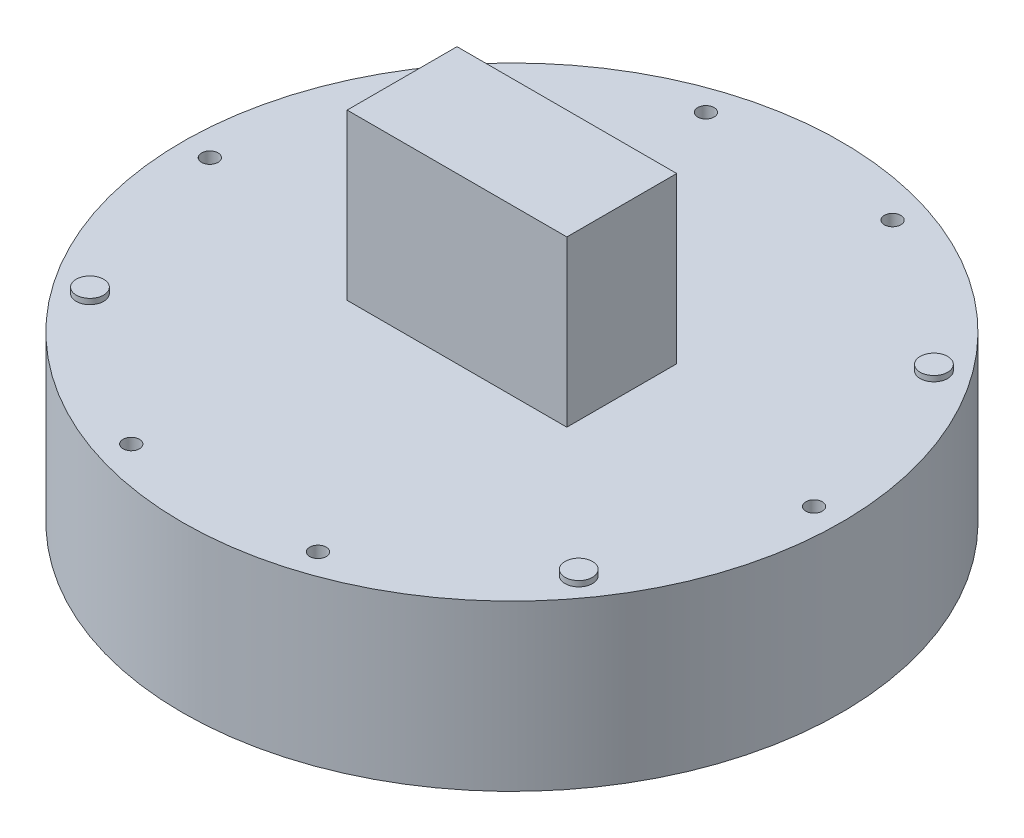
ISO-10303-21;
HEADER;
FILE_DESCRIPTION(('STEP AP214'),'2;1');
FILE_NAME('part.step','',(''),(''),'','','');
FILE_SCHEMA(('AUTOMOTIVE_DESIGN { 1 0 10303 214 1 1 1 1 }'));
ENDSEC;
DATA;
#1=APPLICATION_CONTEXT('core data for automotive mechanical design processes');
#2=APPLICATION_PROTOCOL_DEFINITION('international standard','automotive_design',2000,#1);
#3=PRODUCT_CONTEXT('',#1,'mechanical');
#4=PRODUCT('Part','Part','',(#3));
#5=PRODUCT_RELATED_PRODUCT_CATEGORY('part','',(#4));
#6=PRODUCT_DEFINITION_FORMATION('','',#4);
#7=PRODUCT_DEFINITION_CONTEXT('part definition',#1,'design');
#8=PRODUCT_DEFINITION('design','',#6,#7);
#9=PRODUCT_DEFINITION_SHAPE('','',#8);
#10=(LENGTH_UNIT() NAMED_UNIT(*) SI_UNIT(.MILLI.,.METRE.));
#11=(NAMED_UNIT(*) PLANE_ANGLE_UNIT() SI_UNIT($,.RADIAN.));
#12=(NAMED_UNIT(*) SI_UNIT($,.STERADIAN.) SOLID_ANGLE_UNIT());
#13=UNCERTAINTY_MEASURE_WITH_UNIT(LENGTH_MEASURE(1.E-05),#10,'distance_accuracy_value','');
#14=(GEOMETRIC_REPRESENTATION_CONTEXT(3) GLOBAL_UNCERTAINTY_ASSIGNED_CONTEXT((#13)) GLOBAL_UNIT_ASSIGNED_CONTEXT((#10,
#11,#12)) REPRESENTATION_CONTEXT('',''));
#15=CARTESIAN_POINT('',(0.,0.,0.));
#16=DIRECTION('',(0.,0.,1.));
#17=DIRECTION('',(1.,0.,0.));
#18=AXIS2_PLACEMENT_3D('',#15,#16,#17);
#19=CARTESIAN_POINT('',(0.,30.,0.));
#20=DIRECTION('',(0.,1.,0.));
#21=DIRECTION('',(0.,0.,1.));
#22=AXIS2_PLACEMENT_3D('',#19,#20,#21);
#23=PLANE('',#22);
#24=CARTESIAN_POINT('',(44.4959346906225,30.,32.3281888760854));
#25=DIRECTION('',(0.,1.,0.));
#26=DIRECTION('',(0.,0.,1.));
#27=AXIS2_PLACEMENT_3D('',#24,#25,#26);
#28=CIRCLE('',#27,2.5);
#29=CARTESIAN_POINT('',(44.4959346906225,30.,34.8281888760854));
#30=VERTEX_POINT('',#29);
#31=EDGE_CURVE('E603',#30,#30,#28,.T.);
#32=ORIENTED_EDGE('',*,*,#31,.F.);
#33=EDGE_LOOP('',(#32));
#34=FACE_BOUND('',#33,.T.);
#35=CARTESIAN_POINT('',(-44.4959346906218,30.,32.3281888760864));
#36=DIRECTION('',(0.,1.,0.));
#37=DIRECTION('',(0.,0.,1.));
#38=AXIS2_PLACEMENT_3D('',#35,#36,#37);
#39=CIRCLE('',#38,2.5);
#40=CARTESIAN_POINT('',(-44.4959346906218,30.,34.8281888760864));
#41=VERTEX_POINT('',#40);
#42=EDGE_CURVE('E594',#41,#41,#39,.T.);
#43=ORIENTED_EDGE('',*,*,#42,.F.);
#44=EDGE_LOOP('',(#43));
#45=FACE_BOUND('',#44,.T.);
#46=CARTESIAN_POINT('',(44.4959346906221,30.,-32.3281888760861));
#47=DIRECTION('',(0.,1.,0.));
#48=DIRECTION('',(0.,0.,1.));
#49=AXIS2_PLACEMENT_3D('',#46,#47,#48);
#50=CIRCLE('',#49,2.5);
#51=CARTESIAN_POINT('',(44.4959346906221,30.,-29.8281888760861));
#52=VERTEX_POINT('',#51);
#53=EDGE_CURVE('E585',#52,#52,#50,.T.);
#54=ORIENTED_EDGE('',*,*,#53,.F.);
#55=EDGE_LOOP('',(#54));
#56=FACE_BOUND('',#55,.T.);
#57=CARTESIAN_POINT('',(-44.4959346906223,30.,-32.3281888760858));
#58=DIRECTION('',(0.,1.,0.));
#59=DIRECTION('',(0.,0.,1.));
#60=AXIS2_PLACEMENT_3D('',#57,#58,#59);
#61=CIRCLE('',#60,2.5);
#62=CARTESIAN_POINT('',(-44.4959346906223,30.,-29.8281888760858));
#63=VERTEX_POINT('',#62);
#64=EDGE_CURVE('E576',#63,#63,#61,.T.);
#65=ORIENTED_EDGE('',*,*,#64,.F.);
#66=EDGE_LOOP('',(#65));
#67=FACE_BOUND('',#66,.T.);
#68=CARTESIAN_POINT('',(16.9959346906227,30.,52.3081083962333));
#69=DIRECTION('',(0.,1.,0.));
#70=DIRECTION('',(-0.95105651629515,0.,0.309016994374958));
#71=AXIS2_PLACEMENT_3D('',#68,#69,#70);
#72=CIRCLE('',#71,1.5);
#73=CARTESIAN_POINT('',(15.56934991618,30.,52.7716338877957));
#74=VERTEX_POINT('',#73);
#75=EDGE_CURVE('E150',#74,#74,#72,.T.);
#76=ORIENTED_EDGE('',*,*,#75,.F.);
#77=EDGE_LOOP('',(#76));
#78=FACE_BOUND('',#77,.T.);
#79=CARTESIAN_POINT('',(-16.9959346906216,30.,52.3081083962336));
#80=DIRECTION('',(0.,1.,0.));
#81=DIRECTION('',(-0.951056516295157,0.,-0.309016994374938));
#82=AXIS2_PLACEMENT_3D('',#79,#80,#81);
#83=CIRCLE('',#82,1.5);
#84=CARTESIAN_POINT('',(-18.4225194650643,30.,51.8445829046712));
#85=VERTEX_POINT('',#84);
#86=EDGE_CURVE('E144',#85,#85,#83,.T.);
#87=ORIENTED_EDGE('',*,*,#86,.F.);
#88=EDGE_LOOP('',(#87));
#89=FACE_BOUND('',#88,.T.);
#90=CARTESIAN_POINT('',(-55.,30.,0.));
#91=DIRECTION('',(0.,1.,0.));
#92=DIRECTION('',(0.,0.,-1.));
#93=AXIS2_PLACEMENT_3D('',#90,#91,#92);
#94=CIRCLE('',#93,1.5);
#95=CARTESIAN_POINT('',(-55.,30.,-1.5));
#96=VERTEX_POINT('',#95);
#97=EDGE_CURVE('E135',#96,#96,#94,.T.);
#98=ORIENTED_EDGE('',*,*,#97,.F.);
#99=EDGE_LOOP('',(#98));
#100=FACE_BOUND('',#99,.T.);
#101=CARTESIAN_POINT('',(-16.9959346906223,30.,-52.3081083962334));
#102=DIRECTION('',(0.,1.,0.));
#103=DIRECTION('',(0.951056516295152,0.,-0.309016994374952));
#104=AXIS2_PLACEMENT_3D('',#101,#102,#103);
#105=CIRCLE('',#104,1.5);
#106=CARTESIAN_POINT('',(-15.5693499161796,30.,-52.7716338877958));
#107=VERTEX_POINT('',#106);
#108=EDGE_CURVE('E126',#107,#107,#105,.T.);
#109=ORIENTED_EDGE('',*,*,#108,.F.);
#110=EDGE_LOOP('',(#109));
#111=FACE_BOUND('',#110,.T.);
#112=CARTESIAN_POINT('',(16.995934690622,30.,-52.3081083962335));
#113=DIRECTION('',(0.,1.,0.));
#114=DIRECTION('',(0.951056516295155,0.,0.309016994374945));
#115=AXIS2_PLACEMENT_3D('',#112,#113,#114);
#116=CIRCLE('',#115,1.5);
#117=CARTESIAN_POINT('',(18.4225194650647,30.,-51.8445829046711));
#118=VERTEX_POINT('',#117);
#119=EDGE_CURVE('E120',#118,#118,#116,.T.);
#120=ORIENTED_EDGE('',*,*,#119,.F.);
#121=EDGE_LOOP('',(#120));
#122=FACE_BOUND('',#121,.T.);
#123=CARTESIAN_POINT('',(55.,30.,0.));
#124=DIRECTION('',(0.,1.,0.));
#125=DIRECTION('',(0.,0.,1.));
#126=AXIS2_PLACEMENT_3D('',#123,#124,#125);
#127=CIRCLE('',#126,1.5);
#128=CARTESIAN_POINT('',(55.,30.,1.5));
#129=VERTEX_POINT('',#128);
#130=EDGE_CURVE('E157',#129,#129,#127,.T.);
#131=ORIENTED_EDGE('',*,*,#130,.F.);
#132=EDGE_LOOP('',(#131));
#133=FACE_BOUND('',#132,.T.);
#134=CARTESIAN_POINT('',(0.,30.,0.));
#135=DIRECTION('',(0.,1.,0.));
#136=DIRECTION('',(0.,0.,1.));
#137=AXIS2_PLACEMENT_3D('',#134,#135,#136);
#138=CIRCLE('',#137,60.);
#139=CARTESIAN_POINT('',(0.,30.,60.));
#140=VERTEX_POINT('',#139);
#141=EDGE_CURVE('E11',#140,#140,#138,.T.);
#142=ORIENTED_EDGE('',*,*,#141,.T.);
#143=EDGE_LOOP('',(#142));
#144=FACE_BOUND('',#143,.T.);
#145=DIRECTION('',(-1.,0.,0.));
#146=VECTOR('',#145,1.);
#147=CARTESIAN_POINT('',(-20.,30.,-10.));
#148=LINE('',#147,#146);
#149=CARTESIAN_POINT('',(20.,30.,-10.));
#150=VERTEX_POINT('',#149);
#151=CARTESIAN_POINT('',(-20.,30.,-10.));
#152=VERTEX_POINT('',#151);
#153=EDGE_CURVE('E93',#150,#152,#148,.T.);
#154=ORIENTED_EDGE('',*,*,#153,.F.);
#155=DIRECTION('',(0.,0.,-1.));
#156=VECTOR('',#155,1.);
#157=CARTESIAN_POINT('',(20.,30.,-10.));
#158=LINE('',#157,#156);
#159=CARTESIAN_POINT('',(20.,30.,10.));
#160=VERTEX_POINT('',#159);
#161=EDGE_CURVE('E104',#160,#150,#158,.T.);
#162=ORIENTED_EDGE('',*,*,#161,.F.);
#163=DIRECTION('',(1.,0.,0.));
#164=VECTOR('',#163,1.);
#165=CARTESIAN_POINT('',(-20.,30.,10.));
#166=LINE('',#165,#164);
#167=CARTESIAN_POINT('',(-20.,30.,10.));
#168=VERTEX_POINT('',#167);
#169=EDGE_CURVE('E74',#168,#160,#166,.T.);
#170=ORIENTED_EDGE('',*,*,#169,.F.);
#171=DIRECTION('',(0.,0.,1.));
#172=VECTOR('',#171,1.);
#173=CARTESIAN_POINT('',(-20.,30.,-10.));
#174=LINE('',#173,#172);
#175=EDGE_CURVE('E109',#152,#168,#174,.T.);
#176=ORIENTED_EDGE('',*,*,#175,.F.);
#177=EDGE_LOOP('',(#154,#162,#170,#176));
#178=FACE_BOUND('',#177,.T.);
#179=ADVANCED_FACE('F36',(#34,#45,#56,#67,#78,#89,#100,#111,#122,#133,#144,#178),#23,.T.);
#180=CARTESIAN_POINT('',(0.,30.,0.));
#181=DIRECTION('',(0.,-1.,0.));
#182=DIRECTION('',(0.,0.,-1.));
#183=AXIS2_PLACEMENT_3D('',#180,#181,#182);
#184=CYLINDRICAL_SURFACE('',#183,60.);
#185=ORIENTED_EDGE('',*,*,#141,.F.);
#186=EDGE_LOOP('',(#185));
#187=FACE_BOUND('',#186,.T.);
#188=CARTESIAN_POINT('',(0.,0.,0.));
#189=DIRECTION('',(0.,1.,0.));
#190=DIRECTION('',(0.,0.,1.));
#191=AXIS2_PLACEMENT_3D('',#188,#189,#190);
#192=CIRCLE('',#191,60.);
#193=CARTESIAN_POINT('',(0.,0.,60.));
#194=VERTEX_POINT('',#193);
#195=EDGE_CURVE('E40',#194,#194,#192,.T.);
#196=ORIENTED_EDGE('',*,*,#195,.T.);
#197=EDGE_LOOP('',(#196));
#198=FACE_BOUND('',#197,.T.);
#199=ADVANCED_FACE('F38',(#187,#198),#184,.T.);
#200=CARTESIAN_POINT('',(0.,0.,0.));
#201=DIRECTION('',(0.,1.,0.));
#202=DIRECTION('',(0.,0.,1.));
#203=AXIS2_PLACEMENT_3D('',#200,#201,#202);
#204=PLANE('',#203);
#205=ORIENTED_EDGE('',*,*,#195,.F.);
#206=EDGE_LOOP('',(#205));
#207=FACE_BOUND('',#206,.T.);
#208=ADVANCED_FACE('F279',(#207),#204,.F.);
#209=CARTESIAN_POINT('',(55.,25.,0.));
#210=DIRECTION('',(0.,1.,0.));
#211=DIRECTION('',(0.,0.,1.));
#212=AXIS2_PLACEMENT_3D('',#209,#210,#211);
#213=CYLINDRICAL_SURFACE('',#212,1.5);
#214=CARTESIAN_POINT('',(55.,25.,0.));
#215=DIRECTION('',(0.,1.,0.));
#216=DIRECTION('',(0.,0.,1.));
#217=AXIS2_PLACEMENT_3D('',#214,#215,#216);
#218=CIRCLE('',#217,1.5);
#219=CARTESIAN_POINT('',(55.,25.,1.5));
#220=VERTEX_POINT('',#219);
#221=EDGE_CURVE('E158',#220,#220,#218,.T.);
#222=ORIENTED_EDGE('',*,*,#221,.F.);
#223=EDGE_LOOP('',(#222));
#224=FACE_BOUND('',#223,.T.);
#225=ORIENTED_EDGE('',*,*,#130,.T.);
#226=EDGE_LOOP('',(#225));
#227=FACE_BOUND('',#226,.T.);
#228=ADVANCED_FACE('F164',(#224,#227),#213,.F.);
#229=CARTESIAN_POINT('',(55.,25.,0.));
#230=DIRECTION('',(0.,1.,0.));
#231=DIRECTION('',(0.,0.,1.));
#232=AXIS2_PLACEMENT_3D('',#229,#230,#231);
#233=PLANE('',#232);
#234=ORIENTED_EDGE('',*,*,#221,.T.);
#235=EDGE_LOOP('',(#234));
#236=FACE_BOUND('',#235,.T.);
#237=ADVANCED_FACE('F200',(#236),#233,.T.);
#238=CARTESIAN_POINT('',(16.995934690622,25.,-52.3081083962335));
#239=DIRECTION('',(0.,1.,0.));
#240=DIRECTION('',(0.,0.,1.));
#241=AXIS2_PLACEMENT_3D('',#238,#239,#240);
#242=CYLINDRICAL_SURFACE('',#241,1.5);
#243=CARTESIAN_POINT('',(16.995934690622,25.,-52.3081083962335));
#244=DIRECTION('',(0.,1.,0.));
#245=DIRECTION('',(0.951056516295155,0.,0.309016994374945));
#246=AXIS2_PLACEMENT_3D('',#243,#244,#245);
#247=CIRCLE('',#246,1.5);
#248=CARTESIAN_POINT('',(18.4225194650647,25.,-51.8445829046711));
#249=VERTEX_POINT('',#248);
#250=EDGE_CURVE('E116',#249,#249,#247,.T.);
#251=ORIENTED_EDGE('',*,*,#250,.F.);
#252=EDGE_LOOP('',(#251));
#253=FACE_BOUND('',#252,.T.);
#254=ORIENTED_EDGE('',*,*,#119,.T.);
#255=EDGE_LOOP('',(#254));
#256=FACE_BOUND('',#255,.T.);
#257=ADVANCED_FACE('F196',(#253,#256),#242,.F.);
#258=CARTESIAN_POINT('',(16.995934690622,25.,-52.3081083962335));
#259=DIRECTION('',(0.,1.,0.));
#260=DIRECTION('',(0.951056516295155,0.,0.309016994374945));
#261=AXIS2_PLACEMENT_3D('',#258,#259,#260);
#262=PLANE('',#261);
#263=ORIENTED_EDGE('',*,*,#250,.T.);
#264=EDGE_LOOP('',(#263));
#265=FACE_BOUND('',#264,.T.);
#266=ADVANCED_FACE('F192',(#265),#262,.T.);
#267=CARTESIAN_POINT('',(-16.9959346906223,25.,-52.3081083962334));
#268=DIRECTION('',(0.,1.,0.));
#269=DIRECTION('',(0.,0.,1.));
#270=AXIS2_PLACEMENT_3D('',#267,#268,#269);
#271=CYLINDRICAL_SURFACE('',#270,1.5);
#272=CARTESIAN_POINT('',(-16.9959346906223,25.,-52.3081083962334));
#273=DIRECTION('',(0.,1.,0.));
#274=DIRECTION('',(0.951056516295152,0.,-0.309016994374952));
#275=AXIS2_PLACEMENT_3D('',#272,#273,#274);
#276=CIRCLE('',#275,1.5);
#277=CARTESIAN_POINT('',(-15.5693499161796,25.,-52.7716338877958));
#278=VERTEX_POINT('',#277);
#279=EDGE_CURVE('E123',#278,#278,#276,.T.);
#280=ORIENTED_EDGE('',*,*,#279,.F.);
#281=EDGE_LOOP('',(#280));
#282=FACE_BOUND('',#281,.T.);
#283=ORIENTED_EDGE('',*,*,#108,.T.);
#284=EDGE_LOOP('',(#283));
#285=FACE_BOUND('',#284,.T.);
#286=ADVANCED_FACE('F195',(#282,#285),#271,.F.);
#287=CARTESIAN_POINT('',(-16.9959346906223,25.,-52.3081083962334));
#288=DIRECTION('',(0.,1.,0.));
#289=DIRECTION('',(0.951056516295152,0.,-0.309016994374952));
#290=AXIS2_PLACEMENT_3D('',#287,#288,#289);
#291=PLANE('',#290);
#292=ORIENTED_EDGE('',*,*,#279,.T.);
#293=EDGE_LOOP('',(#292));
#294=FACE_BOUND('',#293,.T.);
#295=ADVANCED_FACE('F202',(#294),#291,.T.);
#296=CARTESIAN_POINT('',(-55.,25.,0.));
#297=DIRECTION('',(0.,1.,0.));
#298=DIRECTION('',(0.,0.,1.));
#299=AXIS2_PLACEMENT_3D('',#296,#297,#298);
#300=CYLINDRICAL_SURFACE('',#299,1.5);
#301=CARTESIAN_POINT('',(-55.,25.,0.));
#302=DIRECTION('',(0.,1.,0.));
#303=DIRECTION('',(0.,0.,-1.));
#304=AXIS2_PLACEMENT_3D('',#301,#302,#303);
#305=CIRCLE('',#304,1.5);
#306=CARTESIAN_POINT('',(-55.,25.,-1.5));
#307=VERTEX_POINT('',#306);
#308=EDGE_CURVE('E132',#307,#307,#305,.T.);
#309=ORIENTED_EDGE('',*,*,#308,.F.);
#310=EDGE_LOOP('',(#309));
#311=FACE_BOUND('',#310,.T.);
#312=ORIENTED_EDGE('',*,*,#97,.T.);
#313=EDGE_LOOP('',(#312));
#314=FACE_BOUND('',#313,.T.);
#315=ADVANCED_FACE('F205',(#311,#314),#300,.F.);
#316=CARTESIAN_POINT('',(-55.,25.,0.));
#317=DIRECTION('',(0.,1.,0.));
#318=DIRECTION('',(0.,0.,-1.));
#319=AXIS2_PLACEMENT_3D('',#316,#317,#318);
#320=PLANE('',#319);
#321=ORIENTED_EDGE('',*,*,#308,.T.);
#322=EDGE_LOOP('',(#321));
#323=FACE_BOUND('',#322,.T.);
#324=ADVANCED_FACE('F221',(#323),#320,.T.);
#325=CARTESIAN_POINT('',(-16.9959346906216,25.,52.3081083962336));
#326=DIRECTION('',(0.,1.,0.));
#327=DIRECTION('',(0.,0.,1.));
#328=AXIS2_PLACEMENT_3D('',#325,#326,#327);
#329=CYLINDRICAL_SURFACE('',#328,1.5);
#330=CARTESIAN_POINT('',(-16.9959346906216,25.,52.3081083962336));
#331=DIRECTION('',(0.,1.,0.));
#332=DIRECTION('',(-0.951056516295157,0.,-0.309016994374938));
#333=AXIS2_PLACEMENT_3D('',#330,#331,#332);
#334=CIRCLE('',#333,1.5);
#335=CARTESIAN_POINT('',(-18.4225194650643,25.,51.8445829046712));
#336=VERTEX_POINT('',#335);
#337=EDGE_CURVE('E141',#336,#336,#334,.T.);
#338=ORIENTED_EDGE('',*,*,#337,.F.);
#339=EDGE_LOOP('',(#338));
#340=FACE_BOUND('',#339,.T.);
#341=ORIENTED_EDGE('',*,*,#86,.T.);
#342=EDGE_LOOP('',(#341));
#343=FACE_BOUND('',#342,.T.);
#344=ADVANCED_FACE('F224',(#340,#343),#329,.F.);
#345=CARTESIAN_POINT('',(-16.9959346906216,25.,52.3081083962336));
#346=DIRECTION('',(0.,1.,0.));
#347=DIRECTION('',(-0.951056516295157,0.,-0.309016994374938));
#348=AXIS2_PLACEMENT_3D('',#345,#346,#347);
#349=PLANE('',#348);
#350=ORIENTED_EDGE('',*,*,#337,.T.);
#351=EDGE_LOOP('',(#350));
#352=FACE_BOUND('',#351,.T.);
#353=ADVANCED_FACE('F240',(#352),#349,.T.);
#354=CARTESIAN_POINT('',(16.9959346906227,25.,52.3081083962333));
#355=DIRECTION('',(0.,1.,0.));
#356=DIRECTION('',(0.,0.,1.));
#357=AXIS2_PLACEMENT_3D('',#354,#355,#356);
#358=CYLINDRICAL_SURFACE('',#357,1.5);
#359=CARTESIAN_POINT('',(16.9959346906227,25.,52.3081083962333));
#360=DIRECTION('',(0.,1.,0.));
#361=DIRECTION('',(-0.95105651629515,0.,0.309016994374958));
#362=AXIS2_PLACEMENT_3D('',#359,#360,#361);
#363=CIRCLE('',#362,1.5);
#364=CARTESIAN_POINT('',(15.56934991618,25.,52.7716338877957));
#365=VERTEX_POINT('',#364);
#366=EDGE_CURVE('E147',#365,#365,#363,.T.);
#367=ORIENTED_EDGE('',*,*,#366,.F.);
#368=EDGE_LOOP('',(#367));
#369=FACE_BOUND('',#368,.T.);
#370=ORIENTED_EDGE('',*,*,#75,.T.);
#371=EDGE_LOOP('',(#370));
#372=FACE_BOUND('',#371,.T.);
#373=ADVANCED_FACE('F243',(#369,#372),#358,.F.);
#374=CARTESIAN_POINT('',(16.9959346906227,25.,52.3081083962333));
#375=DIRECTION('',(0.,1.,0.));
#376=DIRECTION('',(-0.95105651629515,0.,0.309016994374958));
#377=AXIS2_PLACEMENT_3D('',#374,#375,#376);
#378=PLANE('',#377);
#379=ORIENTED_EDGE('',*,*,#366,.T.);
#380=EDGE_LOOP('',(#379));
#381=FACE_BOUND('',#380,.T.);
#382=ADVANCED_FACE('F191',(#381),#378,.T.);
#383=CARTESIAN_POINT('',(20.,60.,-10.));
#384=DIRECTION('',(-1.,0.,0.));
#385=DIRECTION('',(0.,0.,1.));
#386=AXIS2_PLACEMENT_3D('',#383,#384,#385);
#387=PLANE('',#386);
#388=ORIENTED_EDGE('',*,*,#161,.T.);
#389=DIRECTION('',(0.,-1.,0.));
#390=VECTOR('',#389,1.);
#391=CARTESIAN_POINT('',(20.,60.,-10.));
#392=LINE('',#391,#390);
#393=CARTESIAN_POINT('',(20.,60.,-10.));
#394=VERTEX_POINT('',#393);
#395=EDGE_CURVE('E96',#394,#150,#392,.T.);
#396=ORIENTED_EDGE('',*,*,#395,.F.);
#397=DIRECTION('',(0.,0.,-1.));
#398=VECTOR('',#397,1.);
#399=CARTESIAN_POINT('',(20.,60.,-10.));
#400=LINE('',#399,#398);
#401=CARTESIAN_POINT('',(20.,60.,10.));
#402=VERTEX_POINT('',#401);
#403=EDGE_CURVE('E86',#402,#394,#400,.T.);
#404=ORIENTED_EDGE('',*,*,#403,.F.);
#405=DIRECTION('',(0.,-1.,0.));
#406=VECTOR('',#405,1.);
#407=CARTESIAN_POINT('',(20.,60.,10.));
#408=LINE('',#407,#406);
#409=EDGE_CURVE('E100',#402,#160,#408,.T.);
#410=ORIENTED_EDGE('',*,*,#409,.T.);
#411=EDGE_LOOP('',(#388,#396,#404,#410));
#412=FACE_BOUND('',#411,.T.);
#413=ADVANCED_FACE('F174',(#412),#387,.F.);
#414=CARTESIAN_POINT('',(-20.,60.,-10.));
#415=DIRECTION('',(0.,0.,1.));
#416=DIRECTION('',(1.,0.,0.));
#417=AXIS2_PLACEMENT_3D('',#414,#415,#416);
#418=PLANE('',#417);
#419=ORIENTED_EDGE('',*,*,#153,.T.);
#420=DIRECTION('',(0.,-1.,0.));
#421=VECTOR('',#420,1.);
#422=CARTESIAN_POINT('',(-20.,60.,-10.));
#423=LINE('',#422,#421);
#424=CARTESIAN_POINT('',(-20.,60.,-10.));
#425=VERTEX_POINT('',#424);
#426=EDGE_CURVE('E90',#425,#152,#423,.T.);
#427=ORIENTED_EDGE('',*,*,#426,.F.);
#428=DIRECTION('',(-1.,0.,0.));
#429=VECTOR('',#428,1.);
#430=CARTESIAN_POINT('',(-20.,60.,-10.));
#431=LINE('',#430,#429);
#432=EDGE_CURVE('E81',#394,#425,#431,.T.);
#433=ORIENTED_EDGE('',*,*,#432,.F.);
#434=ORIENTED_EDGE('',*,*,#395,.T.);
#435=EDGE_LOOP('',(#419,#427,#433,#434));
#436=FACE_BOUND('',#435,.T.);
#437=ADVANCED_FACE('F91',(#436),#418,.F.);
#438=CARTESIAN_POINT('',(-20.,60.,-10.));
#439=DIRECTION('',(1.,0.,0.));
#440=DIRECTION('',(0.,0.,-1.));
#441=AXIS2_PLACEMENT_3D('',#438,#439,#440);
#442=PLANE('',#441);
#443=ORIENTED_EDGE('',*,*,#175,.T.);
#444=DIRECTION('',(0.,-1.,0.));
#445=VECTOR('',#444,1.);
#446=CARTESIAN_POINT('',(-20.,60.,10.));
#447=LINE('',#446,#445);
#448=CARTESIAN_POINT('',(-20.,60.,10.));
#449=VERTEX_POINT('',#448);
#450=EDGE_CURVE('E52',#449,#168,#447,.T.);
#451=ORIENTED_EDGE('',*,*,#450,.F.);
#452=DIRECTION('',(0.,0.,1.));
#453=VECTOR('',#452,1.);
#454=CARTESIAN_POINT('',(-20.,60.,-10.));
#455=LINE('',#454,#453);
#456=EDGE_CURVE('E84',#425,#449,#455,.T.);
#457=ORIENTED_EDGE('',*,*,#456,.F.);
#458=ORIENTED_EDGE('',*,*,#426,.T.);
#459=EDGE_LOOP('',(#443,#451,#457,#458));
#460=FACE_BOUND('',#459,.T.);
#461=ADVANCED_FACE('F98',(#460),#442,.F.);
#462=CARTESIAN_POINT('',(-20.,60.,10.));
#463=DIRECTION('',(0.,0.,-1.));
#464=DIRECTION('',(-1.,0.,0.));
#465=AXIS2_PLACEMENT_3D('',#462,#463,#464);
#466=PLANE('',#465);
#467=ORIENTED_EDGE('',*,*,#169,.T.);
#468=ORIENTED_EDGE('',*,*,#409,.F.);
#469=DIRECTION('',(1.,0.,0.));
#470=VECTOR('',#469,1.);
#471=CARTESIAN_POINT('',(-20.,60.,10.));
#472=LINE('',#471,#470);
#473=EDGE_CURVE('E60',#449,#402,#472,.T.);
#474=ORIENTED_EDGE('',*,*,#473,.F.);
#475=ORIENTED_EDGE('',*,*,#450,.T.);
#476=EDGE_LOOP('',(#467,#468,#474,#475));
#477=FACE_BOUND('',#476,.T.);
#478=ADVANCED_FACE('F175',(#477),#466,.F.);
#479=CARTESIAN_POINT('',(0.,60.,0.));
#480=DIRECTION('',(0.,1.,0.));
#481=DIRECTION('',(0.,0.,1.));
#482=AXIS2_PLACEMENT_3D('',#479,#480,#481);
#483=PLANE('',#482);
#484=ORIENTED_EDGE('',*,*,#403,.T.);
#485=ORIENTED_EDGE('',*,*,#432,.T.);
#486=ORIENTED_EDGE('',*,*,#456,.T.);
#487=ORIENTED_EDGE('',*,*,#473,.T.);
#488=EDGE_LOOP('',(#484,#485,#486,#487));
#489=FACE_BOUND('',#488,.T.);
#490=ADVANCED_FACE('F82',(#489),#483,.T.);
#491=CARTESIAN_POINT('',(-44.4959346906223,31.,-32.3281888760858));
#492=DIRECTION('',(0.,-1.,0.));
#493=DIRECTION('',(0.,0.,-1.));
#494=AXIS2_PLACEMENT_3D('',#491,#492,#493);
#495=CYLINDRICAL_SURFACE('',#494,2.5);
#496=CARTESIAN_POINT('',(-44.4959346906223,31.,-32.3281888760858));
#497=DIRECTION('',(0.,1.,0.));
#498=DIRECTION('',(0.,0.,1.));
#499=AXIS2_PLACEMENT_3D('',#496,#497,#498);
#500=CIRCLE('',#499,2.5);
#501=CARTESIAN_POINT('',(-44.4959346906223,31.,-29.8281888760858));
#502=VERTEX_POINT('',#501);
#503=EDGE_CURVE('E573',#502,#502,#500,.T.);
#504=ORIENTED_EDGE('',*,*,#503,.F.);
#505=EDGE_LOOP('',(#504));
#506=FACE_BOUND('',#505,.T.);
#507=ORIENTED_EDGE('',*,*,#64,.T.);
#508=EDGE_LOOP('',(#507));
#509=FACE_BOUND('',#508,.T.);
#510=ADVANCED_FACE('F182',(#506,#509),#495,.T.);
#511=CARTESIAN_POINT('',(-44.4959346906223,31.,-32.3281888760858));
#512=DIRECTION('',(0.,1.,0.));
#513=DIRECTION('',(0.,0.,1.));
#514=AXIS2_PLACEMENT_3D('',#511,#512,#513);
#515=PLANE('',#514);
#516=ORIENTED_EDGE('',*,*,#503,.T.);
#517=EDGE_LOOP('',(#516));
#518=FACE_BOUND('',#517,.T.);
#519=ADVANCED_FACE('F458',(#518),#515,.T.);
#520=CARTESIAN_POINT('',(44.4959346906221,31.,-32.3281888760861));
#521=DIRECTION('',(0.,-1.,0.));
#522=DIRECTION('',(0.,0.,-1.));
#523=AXIS2_PLACEMENT_3D('',#520,#521,#522);
#524=CYLINDRICAL_SURFACE('',#523,2.5);
#525=CARTESIAN_POINT('',(44.4959346906221,31.,-32.3281888760861));
#526=DIRECTION('',(0.,1.,0.));
#527=DIRECTION('',(0.,0.,1.));
#528=AXIS2_PLACEMENT_3D('',#525,#526,#527);
#529=CIRCLE('',#528,2.5);
#530=CARTESIAN_POINT('',(44.4959346906221,31.,-29.8281888760861));
#531=VERTEX_POINT('',#530);
#532=EDGE_CURVE('E584',#531,#531,#529,.T.);
#533=ORIENTED_EDGE('',*,*,#532,.F.);
#534=EDGE_LOOP('',(#533));
#535=FACE_BOUND('',#534,.T.);
#536=ORIENTED_EDGE('',*,*,#53,.T.);
#537=EDGE_LOOP('',(#536));
#538=FACE_BOUND('',#537,.T.);
#539=ADVANCED_FACE('F467',(#535,#538),#524,.T.);
#540=CARTESIAN_POINT('',(44.4959346906221,31.,-32.3281888760861));
#541=DIRECTION('',(0.,1.,0.));
#542=DIRECTION('',(0.,0.,1.));
#543=AXIS2_PLACEMENT_3D('',#540,#541,#542);
#544=PLANE('',#543);
#545=ORIENTED_EDGE('',*,*,#532,.T.);
#546=EDGE_LOOP('',(#545));
#547=FACE_BOUND('',#546,.T.);
#548=ADVANCED_FACE('F477',(#547),#544,.T.);
#549=CARTESIAN_POINT('',(-44.4959346906218,31.,32.3281888760864));
#550=DIRECTION('',(0.,-1.,0.));
#551=DIRECTION('',(0.,0.,-1.));
#552=AXIS2_PLACEMENT_3D('',#549,#550,#551);
#553=CYLINDRICAL_SURFACE('',#552,2.5);
#554=CARTESIAN_POINT('',(-44.4959346906218,31.,32.3281888760864));
#555=DIRECTION('',(0.,1.,0.));
#556=DIRECTION('',(0.,0.,1.));
#557=AXIS2_PLACEMENT_3D('',#554,#555,#556);
#558=CIRCLE('',#557,2.5);
#559=CARTESIAN_POINT('',(-44.4959346906218,31.,34.8281888760864));
#560=VERTEX_POINT('',#559);
#561=EDGE_CURVE('E593',#560,#560,#558,.T.);
#562=ORIENTED_EDGE('',*,*,#561,.F.);
#563=EDGE_LOOP('',(#562));
#564=FACE_BOUND('',#563,.T.);
#565=ORIENTED_EDGE('',*,*,#42,.T.);
#566=EDGE_LOOP('',(#565));
#567=FACE_BOUND('',#566,.T.);
#568=ADVANCED_FACE('F487',(#564,#567),#553,.T.);
#569=CARTESIAN_POINT('',(-44.4959346906218,31.,32.3281888760864));
#570=DIRECTION('',(0.,1.,0.));
#571=DIRECTION('',(0.,0.,1.));
#572=AXIS2_PLACEMENT_3D('',#569,#570,#571);
#573=PLANE('',#572);
#574=ORIENTED_EDGE('',*,*,#561,.T.);
#575=EDGE_LOOP('',(#574));
#576=FACE_BOUND('',#575,.T.);
#577=ADVANCED_FACE('F497',(#576),#573,.T.);
#578=CARTESIAN_POINT('',(44.4959346906225,31.,32.3281888760854));
#579=DIRECTION('',(0.,-1.,0.));
#580=DIRECTION('',(0.,0.,-1.));
#581=AXIS2_PLACEMENT_3D('',#578,#579,#580);
#582=CYLINDRICAL_SURFACE('',#581,2.5);
#583=CARTESIAN_POINT('',(44.4959346906225,31.,32.3281888760854));
#584=DIRECTION('',(0.,1.,0.));
#585=DIRECTION('',(0.,0.,1.));
#586=AXIS2_PLACEMENT_3D('',#583,#584,#585);
#587=CIRCLE('',#586,2.5);
#588=CARTESIAN_POINT('',(44.4959346906225,31.,34.8281888760854));
#589=VERTEX_POINT('',#588);
#590=EDGE_CURVE('E602',#589,#589,#587,.T.);
#591=ORIENTED_EDGE('',*,*,#590,.F.);
#592=EDGE_LOOP('',(#591));
#593=FACE_BOUND('',#592,.T.);
#594=ORIENTED_EDGE('',*,*,#31,.T.);
#595=EDGE_LOOP('',(#594));
#596=FACE_BOUND('',#595,.T.);
#597=ADVANCED_FACE('F507',(#593,#596),#582,.T.);
#598=CARTESIAN_POINT('',(44.4959346906225,31.,32.3281888760854));
#599=DIRECTION('',(0.,1.,0.));
#600=DIRECTION('',(0.,0.,1.));
#601=AXIS2_PLACEMENT_3D('',#598,#599,#600);
#602=PLANE('',#601);
#603=ORIENTED_EDGE('',*,*,#590,.T.);
#604=EDGE_LOOP('',(#603));
#605=FACE_BOUND('',#604,.T.);
#606=ADVANCED_FACE('F517',(#605),#602,.T.);
#607=CLOSED_SHELL('',(#179,#199,#208,#228,#237,#257,#266,#286,#295,#315,#324,#344,#353,#373,
#382,#413,#437,#461,#478,#490,#510,#519,#539,#548,#568,#577,#597,#606));
#608=CARTESIAN_POINT('',(44.4959346906225,25.,32.3281888760854));
#609=DIRECTION('',(0.,1.,0.));
#610=DIRECTION('',(-0.587785252292462,0.,0.809016994374955));
#611=AXIS2_PLACEMENT_3D('',#608,#609,#610);
#612=PLANE('',#611);
#613=CARTESIAN_POINT('',(44.4959346906225,25.,32.3281888760854));
#614=DIRECTION('',(0.,1.,0.));
#615=DIRECTION('',(-0.587785252292462,0.,0.809016994374955));
#616=AXIS2_PLACEMENT_3D('',#613,#614,#615);
#617=CIRCLE('',#616,1.5);
#618=CARTESIAN_POINT('',(43.6142568121838,25.,33.5417143676479));
#619=VERTEX_POINT('',#618);
#620=EDGE_CURVE('E115',#619,#619,#617,.T.);
#621=ORIENTED_EDGE('',*,*,#620,.T.);
#622=EDGE_LOOP('',(#621));
#623=FACE_BOUND('',#622,.T.);
#624=ADVANCED_FACE('F254',(#623),#612,.T.);
#625=CARTESIAN_POINT('',(44.4959346906225,25.,32.3281888760854));
#626=DIRECTION('',(0.,1.,0.));
#627=DIRECTION('',(0.,0.,1.));
#628=AXIS2_PLACEMENT_3D('',#625,#626,#627);
#629=CYLINDRICAL_SURFACE('',#628,1.5);
#630=ORIENTED_EDGE('',*,*,#620,.F.);
#631=EDGE_LOOP('',(#630));
#632=FACE_BOUND('',#631,.T.);
#633=CARTESIAN_POINT('',(44.4959346906225,30.,32.3281888760854));
#634=DIRECTION('',(0.,1.,0.));
#635=DIRECTION('',(0.,0.,1.));
#636=AXIS2_PLACEMENT_3D('',#633,#634,#635);
#637=CIRCLE('',#636,1.5);
#638=CARTESIAN_POINT('',(44.4959346906225,30.,33.8281888760854));
#639=VERTEX_POINT('',#638);
#640=EDGE_CURVE('E597',#639,#639,#637,.F.);
#641=ORIENTED_EDGE('',*,*,#640,.F.);
#642=EDGE_LOOP('',(#641));
#643=FACE_BOUND('',#642,.T.);
#644=ADVANCED_FACE('F257',(#632,#643),#629,.F.);
#645=CARTESIAN_POINT('',(44.4959346906225,30.,32.3281888760854));
#646=DIRECTION('',(0.,1.,0.));
#647=DIRECTION('',(0.,0.,1.));
#648=AXIS2_PLACEMENT_3D('',#645,#646,#647);
#649=PLANE('',#648);
#650=ORIENTED_EDGE('',*,*,#640,.T.);
#651=EDGE_LOOP('',(#650));
#652=FACE_BOUND('',#651,.T.);
#653=ADVANCED_FACE('F262',(#652),#649,.F.);
#654=CLOSED_SHELL('',(#624,#644,#653));
#655=CARTESIAN_POINT('',(-44.4959346906218,25.,32.3281888760864));
#656=DIRECTION('',(0.,1.,0.));
#657=DIRECTION('',(-0.58778525229248,0.,-0.809016994374942));
#658=AXIS2_PLACEMENT_3D('',#655,#656,#657);
#659=PLANE('',#658);
#660=CARTESIAN_POINT('',(-44.4959346906218,25.,32.3281888760864));
#661=DIRECTION('',(0.,1.,0.));
#662=DIRECTION('',(-0.58778525229248,0.,-0.809016994374942));
#663=AXIS2_PLACEMENT_3D('',#660,#661,#662);
#664=CIRCLE('',#663,1.5);
#665=CARTESIAN_POINT('',(-45.3776125690605,25.,31.114663384524));
#666=VERTEX_POINT('',#665);
#667=EDGE_CURVE('E138',#666,#666,#664,.T.);
#668=ORIENTED_EDGE('',*,*,#667,.T.);
#669=EDGE_LOOP('',(#668));
#670=FACE_BOUND('',#669,.T.);
#671=ADVANCED_FACE('F229',(#670),#659,.T.);
#672=CARTESIAN_POINT('',(-44.4959346906218,25.,32.3281888760864));
#673=DIRECTION('',(0.,1.,0.));
#674=DIRECTION('',(0.,0.,1.));
#675=AXIS2_PLACEMENT_3D('',#672,#673,#674);
#676=CYLINDRICAL_SURFACE('',#675,1.5);
#677=ORIENTED_EDGE('',*,*,#667,.F.);
#678=EDGE_LOOP('',(#677));
#679=FACE_BOUND('',#678,.T.);
#680=CARTESIAN_POINT('',(-44.4959346906218,30.,32.3281888760864));
#681=DIRECTION('',(0.,1.,0.));
#682=DIRECTION('',(0.,0.,1.));
#683=AXIS2_PLACEMENT_3D('',#680,#681,#682);
#684=CIRCLE('',#683,1.5);
#685=CARTESIAN_POINT('',(-44.4959346906218,30.,33.8281888760864));
#686=VERTEX_POINT('',#685);
#687=EDGE_CURVE('E588',#686,#686,#684,.F.);
#688=ORIENTED_EDGE('',*,*,#687,.F.);
#689=EDGE_LOOP('',(#688));
#690=FACE_BOUND('',#689,.T.);
#691=ADVANCED_FACE('F232',(#679,#690),#676,.F.);
#692=CARTESIAN_POINT('',(-44.4959346906218,30.,32.3281888760864));
#693=DIRECTION('',(0.,1.,0.));
#694=DIRECTION('',(0.,0.,1.));
#695=AXIS2_PLACEMENT_3D('',#692,#693,#694);
#696=PLANE('',#695);
#697=ORIENTED_EDGE('',*,*,#687,.T.);
#698=EDGE_LOOP('',(#697));
#699=FACE_BOUND('',#698,.T.);
#700=ADVANCED_FACE('F238',(#699),#696,.F.);
#701=CLOSED_SHELL('',(#671,#691,#700));
#702=CARTESIAN_POINT('',(44.4959346906221,25.,-32.3281888760861));
#703=DIRECTION('',(0.,1.,0.));
#704=DIRECTION('',(0.587785252292474,0.,0.809016994374947));
#705=AXIS2_PLACEMENT_3D('',#702,#703,#704);
#706=PLANE('',#705);
#707=CARTESIAN_POINT('',(44.4959346906221,25.,-32.3281888760861));
#708=DIRECTION('',(0.,1.,0.));
#709=DIRECTION('',(0.587785252292474,0.,0.809016994374947));
#710=AXIS2_PLACEMENT_3D('',#707,#708,#709);
#711=CIRCLE('',#710,1.5);
#712=CARTESIAN_POINT('',(45.3776125690608,25.,-31.1146633845237));
#713=VERTEX_POINT('',#712);
#714=EDGE_CURVE('E119',#713,#713,#711,.T.);
#715=ORIENTED_EDGE('',*,*,#714,.T.);
#716=EDGE_LOOP('',(#715));
#717=FACE_BOUND('',#716,.T.);
#718=ADVANCED_FACE('F264',(#717),#706,.T.);
#719=CARTESIAN_POINT('',(44.4959346906221,25.,-32.3281888760861));
#720=DIRECTION('',(0.,1.,0.));
#721=DIRECTION('',(0.,0.,1.));
#722=AXIS2_PLACEMENT_3D('',#719,#720,#721);
#723=CYLINDRICAL_SURFACE('',#722,1.5);
#724=ORIENTED_EDGE('',*,*,#714,.F.);
#725=EDGE_LOOP('',(#724));
#726=FACE_BOUND('',#725,.T.);
#727=CARTESIAN_POINT('',(44.4959346906221,30.,-32.3281888760861));
#728=DIRECTION('',(0.,1.,0.));
#729=DIRECTION('',(0.,0.,1.));
#730=AXIS2_PLACEMENT_3D('',#727,#728,#729);
#731=CIRCLE('',#730,1.5);
#732=CARTESIAN_POINT('',(44.4959346906221,30.,-30.8281888760861));
#733=VERTEX_POINT('',#732);
#734=EDGE_CURVE('E580',#733,#733,#731,.F.);
#735=ORIENTED_EDGE('',*,*,#734,.F.);
#736=EDGE_LOOP('',(#735));
#737=FACE_BOUND('',#736,.T.);
#738=ADVANCED_FACE('F267',(#726,#737),#723,.F.);
#739=CARTESIAN_POINT('',(44.4959346906221,30.,-32.3281888760861));
#740=DIRECTION('',(0.,1.,0.));
#741=DIRECTION('',(0.,0.,1.));
#742=AXIS2_PLACEMENT_3D('',#739,#740,#741);
#743=PLANE('',#742);
#744=ORIENTED_EDGE('',*,*,#734,.T.);
#745=EDGE_LOOP('',(#744));
#746=FACE_BOUND('',#745,.T.);
#747=ADVANCED_FACE('F273',(#746),#743,.F.);
#748=CLOSED_SHELL('',(#718,#738,#747));
#749=CARTESIAN_POINT('',(-44.4959346906223,25.,-32.3281888760858));
#750=DIRECTION('',(0.,1.,0.));
#751=DIRECTION('',(0.587785252292469,0.,-0.809016994374951));
#752=AXIS2_PLACEMENT_3D('',#749,#750,#751);
#753=PLANE('',#752);
#754=CARTESIAN_POINT('',(-44.4959346906223,25.,-32.3281888760858));
#755=DIRECTION('',(0.,1.,0.));
#756=DIRECTION('',(0.587785252292469,0.,-0.809016994374951));
#757=AXIS2_PLACEMENT_3D('',#754,#755,#756);
#758=CIRCLE('',#757,1.5);
#759=CARTESIAN_POINT('',(-43.6142568121836,25.,-33.5417143676482));
#760=VERTEX_POINT('',#759);
#761=EDGE_CURVE('E129',#760,#760,#758,.T.);
#762=ORIENTED_EDGE('',*,*,#761,.T.);
#763=EDGE_LOOP('',(#762));
#764=FACE_BOUND('',#763,.T.);
#765=ADVANCED_FACE('F210',(#764),#753,.T.);
#766=CARTESIAN_POINT('',(-44.4959346906223,25.,-32.3281888760858));
#767=DIRECTION('',(0.,1.,0.));
#768=DIRECTION('',(0.,0.,1.));
#769=AXIS2_PLACEMENT_3D('',#766,#767,#768);
#770=CYLINDRICAL_SURFACE('',#769,1.5);
#771=ORIENTED_EDGE('',*,*,#761,.F.);
#772=EDGE_LOOP('',(#771));
#773=FACE_BOUND('',#772,.T.);
#774=CARTESIAN_POINT('',(-44.4959346906223,30.,-32.3281888760858));
#775=DIRECTION('',(0.,1.,0.));
#776=DIRECTION('',(0.,0.,1.));
#777=AXIS2_PLACEMENT_3D('',#774,#775,#776);
#778=CIRCLE('',#777,1.5);
#779=CARTESIAN_POINT('',(-44.4959346906223,30.,-30.8281888760858));
#780=VERTEX_POINT('',#779);
#781=EDGE_CURVE('E107',#780,#780,#778,.F.);
#782=ORIENTED_EDGE('',*,*,#781,.F.);
#783=EDGE_LOOP('',(#782));
#784=FACE_BOUND('',#783,.T.);
#785=ADVANCED_FACE('F213',(#773,#784),#770,.F.);
#786=CARTESIAN_POINT('',(-44.4959346906223,30.,-32.3281888760858));
#787=DIRECTION('',(0.,1.,0.));
#788=DIRECTION('',(0.,0.,1.));
#789=AXIS2_PLACEMENT_3D('',#786,#787,#788);
#790=PLANE('',#789);
#791=ORIENTED_EDGE('',*,*,#781,.T.);
#792=EDGE_LOOP('',(#791));
#793=FACE_BOUND('',#792,.T.);
#794=ADVANCED_FACE('F219',(#793),#790,.F.);
#795=CLOSED_SHELL('',(#765,#785,#794));
#796=ORIENTED_CLOSED_SHELL('',*,#654,.T.);
#797=ORIENTED_CLOSED_SHELL('',*,#701,.T.);
#798=ORIENTED_CLOSED_SHELL('',*,#748,.T.);
#799=ORIENTED_CLOSED_SHELL('',*,#795,.T.);
#800=BREP_WITH_VOIDS('B2',#607,(#796,#797,#798,#799));
#801=ADVANCED_BREP_SHAPE_REPRESENTATION('',(#18,#800),#14);
#802=SHAPE_DEFINITION_REPRESENTATION(#9,#801);
ENDSEC;
END-ISO-10303-21;
